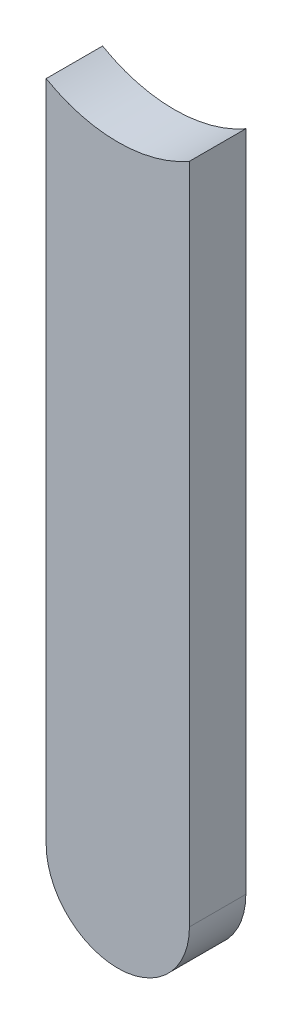
ISO-10303-21;
HEADER;
FILE_DESCRIPTION(('STEP AP214'),'2;1');
FILE_NAME('part.step','',(''),(''),'','','');
FILE_SCHEMA(('AUTOMOTIVE_DESIGN { 1 0 10303 214 1 1 1 1 }'));
ENDSEC;
DATA;
#1=APPLICATION_CONTEXT('core data for automotive mechanical design processes');
#2=APPLICATION_PROTOCOL_DEFINITION('international standard','automotive_design',2000,#1);
#3=PRODUCT_CONTEXT('',#1,'mechanical');
#4=PRODUCT('Part','Part','',(#3));
#5=PRODUCT_RELATED_PRODUCT_CATEGORY('part','',(#4));
#6=PRODUCT_DEFINITION_FORMATION('','',#4);
#7=PRODUCT_DEFINITION_CONTEXT('part definition',#1,'design');
#8=PRODUCT_DEFINITION('design','',#6,#7);
#9=PRODUCT_DEFINITION_SHAPE('','',#8);
#10=(LENGTH_UNIT() NAMED_UNIT(*) SI_UNIT(.MILLI.,.METRE.));
#11=(NAMED_UNIT(*) PLANE_ANGLE_UNIT() SI_UNIT($,.RADIAN.));
#12=(NAMED_UNIT(*) SI_UNIT($,.STERADIAN.) SOLID_ANGLE_UNIT());
#13=UNCERTAINTY_MEASURE_WITH_UNIT(LENGTH_MEASURE(1.E-05),#10,'distance_accuracy_value','');
#14=(GEOMETRIC_REPRESENTATION_CONTEXT(3) GLOBAL_UNCERTAINTY_ASSIGNED_CONTEXT((#13)) GLOBAL_UNIT_ASSIGNED_CONTEXT((#10,
#11,#12)) REPRESENTATION_CONTEXT('',''));
#15=CARTESIAN_POINT('',(0.,0.,0.));
#16=DIRECTION('',(0.,0.,1.));
#17=DIRECTION('',(1.,0.,0.));
#18=AXIS2_PLACEMENT_3D('',#15,#16,#17);
#19=CARTESIAN_POINT('',(101.981,115.192048,0.));
#20=DIRECTION('',(-1.,0.,0.));
#21=DIRECTION('',(0.,1.,0.));
#22=AXIS2_PLACEMENT_3D('',#19,#20,#21);
#23=PLANE('',#22);
#24=DIRECTION('',(0.,1.,0.));
#25=VECTOR('',#24,1.);
#26=CARTESIAN_POINT('',(101.981,115.192048,0.1999996));
#27=LINE('',#26,#25);
#28=CARTESIAN_POINT('',(101.981,115.192048,0.1999996));
#29=VERTEX_POINT('',#28);
#30=CARTESIAN_POINT('',(101.981,117.543059094878,0.1999996));
#31=VERTEX_POINT('',#30);
#32=EDGE_CURVE('E11',#29,#31,#27,.T.);
#33=ORIENTED_EDGE('',*,*,#32,.F.);
#34=DIRECTION('',(0.,0.,1.));
#35=VECTOR('',#34,1.);
#36=CARTESIAN_POINT('',(101.981,115.192048,0.));
#37=LINE('',#36,#35);
#38=CARTESIAN_POINT('',(101.981,115.192048,0.));
#39=VERTEX_POINT('',#38);
#40=EDGE_CURVE('E24',#39,#29,#37,.T.);
#41=ORIENTED_EDGE('',*,*,#40,.F.);
#42=DIRECTION('',(0.,1.,0.));
#43=VECTOR('',#42,1.);
#44=CARTESIAN_POINT('',(101.981,115.192048,0.));
#45=LINE('',#44,#43);
#46=CARTESIAN_POINT('',(101.981,117.543059094878,0.));
#47=VERTEX_POINT('',#46);
#48=EDGE_CURVE('E75',#39,#47,#45,.T.);
#49=ORIENTED_EDGE('',*,*,#48,.T.);
#50=DIRECTION('',(0.,0.,1.));
#51=VECTOR('',#50,1.);
#52=CARTESIAN_POINT('',(101.981,117.543059094878,0.));
#53=LINE('',#52,#51);
#54=EDGE_CURVE('E37',#47,#31,#53,.T.);
#55=ORIENTED_EDGE('',*,*,#54,.T.);
#56=EDGE_LOOP('',(#33,#41,#49,#55));
#57=FACE_BOUND('',#56,.T.);
#58=ADVANCED_FACE('F17',(#57),#23,.F.);
#59=CARTESIAN_POINT('',(101.727,117.983,0.));
#60=DIRECTION('',(0.,0.,-1.));
#61=DIRECTION('',(1.,0.,0.));
#62=AXIS2_PLACEMENT_3D('',#59,#60,#61);
#63=CYLINDRICAL_SURFACE('',#62,0.508);
#64=DIRECTION('',(0.,0.,1.));
#65=VECTOR('',#64,1.);
#66=CARTESIAN_POINT('',(101.473,117.543059094878,0.));
#67=LINE('',#66,#65);
#68=CARTESIAN_POINT('',(101.473,117.543059094878,0.));
#69=VERTEX_POINT('',#68);
#70=CARTESIAN_POINT('',(101.473,117.543059094878,0.1999996));
#71=VERTEX_POINT('',#70);
#72=EDGE_CURVE('E67',#69,#71,#67,.T.);
#73=ORIENTED_EDGE('',*,*,#72,.T.);
#74=CARTESIAN_POINT('',(101.727,117.983,0.1999996));
#75=DIRECTION('',(0.,0.,1.));
#76=DIRECTION('',(1.,0.,0.));
#77=AXIS2_PLACEMENT_3D('',#74,#75,#76);
#78=CIRCLE('',#77,0.508);
#79=EDGE_CURVE('E82',#71,#31,#78,.T.);
#80=ORIENTED_EDGE('',*,*,#79,.T.);
#81=ORIENTED_EDGE('',*,*,#54,.F.);
#82=CARTESIAN_POINT('',(101.727,117.983,0.));
#83=DIRECTION('',(0.,0.,1.));
#84=DIRECTION('',(1.,0.,0.));
#85=AXIS2_PLACEMENT_3D('',#82,#83,#84);
#86=CIRCLE('',#85,0.508);
#87=EDGE_CURVE('E80',#69,#47,#86,.T.);
#88=ORIENTED_EDGE('',*,*,#87,.F.);
#89=EDGE_LOOP('',(#73,#80,#81,#88));
#90=FACE_BOUND('',#89,.T.);
#91=ADVANCED_FACE('F88',(#90),#63,.F.);
#92=CARTESIAN_POINT('',(101.473,117.543059094878,0.));
#93=DIRECTION('',(1.,0.,0.));
#94=DIRECTION('',(0.,-1.,0.));
#95=AXIS2_PLACEMENT_3D('',#92,#93,#94);
#96=PLANE('',#95);
#97=DIRECTION('',(0.,-1.,0.));
#98=VECTOR('',#97,1.);
#99=CARTESIAN_POINT('',(101.473,117.983,0.1999996));
#100=LINE('',#99,#98);
#101=CARTESIAN_POINT('',(101.473,115.192048,0.1999996));
#102=VERTEX_POINT('',#101);
#103=EDGE_CURVE('E71',#71,#102,#100,.T.);
#104=ORIENTED_EDGE('',*,*,#103,.F.);
#105=ORIENTED_EDGE('',*,*,#72,.F.);
#106=DIRECTION('',(0.,-1.,0.));
#107=VECTOR('',#106,1.);
#108=CARTESIAN_POINT('',(101.473,117.983,0.));
#109=LINE('',#108,#107);
#110=CARTESIAN_POINT('',(101.473,115.192048,0.));
#111=VERTEX_POINT('',#110);
#112=EDGE_CURVE('E63',#69,#111,#109,.T.);
#113=ORIENTED_EDGE('',*,*,#112,.T.);
#114=DIRECTION('',(0.,0.,1.));
#115=VECTOR('',#114,1.);
#116=CARTESIAN_POINT('',(101.473,115.192048,0.));
#117=LINE('',#116,#115);
#118=EDGE_CURVE('E53',#111,#102,#117,.T.);
#119=ORIENTED_EDGE('',*,*,#118,.T.);
#120=EDGE_LOOP('',(#104,#105,#113,#119));
#121=FACE_BOUND('',#120,.T.);
#122=ADVANCED_FACE('F66',(#121),#96,.F.);
#123=CARTESIAN_POINT('',(101.727,115.192048,0.));
#124=DIRECTION('',(0.,0.,-1.));
#125=DIRECTION('',(-1.,0.,0.));
#126=AXIS2_PLACEMENT_3D('',#123,#124,#125);
#127=CYLINDRICAL_SURFACE('',#126,0.253999999999995);
#128=CARTESIAN_POINT('',(101.727,115.192048,0.1999996));
#129=DIRECTION('',(0.,0.,1.));
#130=DIRECTION('',(-1.,0.,0.));
#131=AXIS2_PLACEMENT_3D('',#128,#129,#130);
#132=CIRCLE('',#131,0.253999999999995);
#133=EDGE_CURVE('E59',#102,#29,#132,.T.);
#134=ORIENTED_EDGE('',*,*,#133,.F.);
#135=ORIENTED_EDGE('',*,*,#118,.F.);
#136=CARTESIAN_POINT('',(101.727,115.192048,0.));
#137=DIRECTION('',(0.,0.,1.));
#138=DIRECTION('',(-1.,0.,0.));
#139=AXIS2_PLACEMENT_3D('',#136,#137,#138);
#140=CIRCLE('',#139,0.253999999999995);
#141=EDGE_CURVE('E57',#111,#39,#140,.T.);
#142=ORIENTED_EDGE('',*,*,#141,.T.);
#143=ORIENTED_EDGE('',*,*,#40,.T.);
#144=EDGE_LOOP('',(#134,#135,#142,#143));
#145=FACE_BOUND('',#144,.T.);
#146=ADVANCED_FACE('F55',(#145),#127,.T.);
#147=CARTESIAN_POINT('',(101.981,115.192048,0.));
#148=DIRECTION('',(0.,0.,-1.));
#149=DIRECTION('',(-1.,0.,0.));
#150=AXIS2_PLACEMENT_3D('',#147,#148,#149);
#151=PLANE('',#150);
#152=ORIENTED_EDGE('',*,*,#48,.F.);
#153=ORIENTED_EDGE('',*,*,#141,.F.);
#154=ORIENTED_EDGE('',*,*,#112,.F.);
#155=ORIENTED_EDGE('',*,*,#87,.T.);
#156=EDGE_LOOP('',(#152,#153,#154,#155));
#157=FACE_BOUND('',#156,.T.);
#158=ADVANCED_FACE('F74',(#157),#151,.T.);
#159=CARTESIAN_POINT('',(101.981,115.192048,0.1999996));
#160=DIRECTION('',(0.,0.,-1.));
#161=DIRECTION('',(-1.,0.,0.));
#162=AXIS2_PLACEMENT_3D('',#159,#160,#161);
#163=PLANE('',#162);
#164=ORIENTED_EDGE('',*,*,#133,.T.);
#165=ORIENTED_EDGE('',*,*,#32,.T.);
#166=ORIENTED_EDGE('',*,*,#79,.F.);
#167=ORIENTED_EDGE('',*,*,#103,.T.);
#168=EDGE_LOOP('',(#164,#165,#166,#167));
#169=FACE_BOUND('',#168,.T.);
#170=ADVANCED_FACE('F91',(#169),#163,.F.);
#171=CLOSED_SHELL('',(#58,#91,#122,#146,#158,#170));
#172=MANIFOLD_SOLID_BREP('B1',#171);
#173=ADVANCED_BREP_SHAPE_REPRESENTATION('',(#18,#172),#14);
#174=SHAPE_DEFINITION_REPRESENTATION(#9,#173);
ENDSEC;
END-ISO-10303-21;
